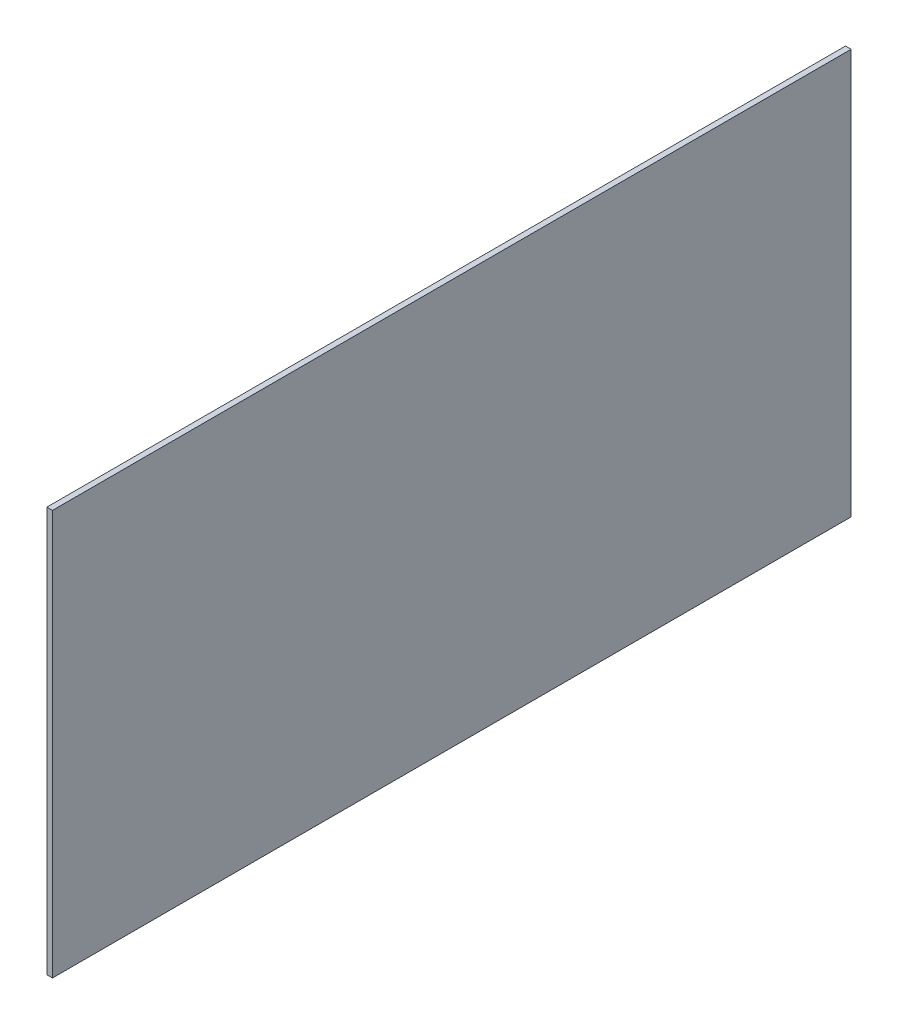
ISO-10303-21;
HEADER;
FILE_DESCRIPTION(('STEP AP214'),'2;1');
FILE_NAME('part.step','',(''),(''),'','','');
FILE_SCHEMA(('AUTOMOTIVE_DESIGN { 1 0 10303 214 1 1 1 1 }'));
ENDSEC;
DATA;
#1=APPLICATION_CONTEXT('core data for automotive mechanical design processes');
#2=APPLICATION_PROTOCOL_DEFINITION('international standard','automotive_design',2000,#1);
#3=PRODUCT_CONTEXT('',#1,'mechanical');
#4=PRODUCT('Part','Part','',(#3));
#5=PRODUCT_RELATED_PRODUCT_CATEGORY('part','',(#4));
#6=PRODUCT_DEFINITION_FORMATION('','',#4);
#7=PRODUCT_DEFINITION_CONTEXT('part definition',#1,'design');
#8=PRODUCT_DEFINITION('design','',#6,#7);
#9=PRODUCT_DEFINITION_SHAPE('','',#8);
#10=(LENGTH_UNIT() NAMED_UNIT(*) SI_UNIT(.MILLI.,.METRE.));
#11=(NAMED_UNIT(*) PLANE_ANGLE_UNIT() SI_UNIT($,.RADIAN.));
#12=(NAMED_UNIT(*) SI_UNIT($,.STERADIAN.) SOLID_ANGLE_UNIT());
#13=UNCERTAINTY_MEASURE_WITH_UNIT(LENGTH_MEASURE(1.E-05),#10,'distance_accuracy_value','');
#14=(GEOMETRIC_REPRESENTATION_CONTEXT(3) GLOBAL_UNCERTAINTY_ASSIGNED_CONTEXT((#13)) GLOBAL_UNIT_ASSIGNED_CONTEXT((#10,
#11,#12)) REPRESENTATION_CONTEXT('',''));
#15=CARTESIAN_POINT('',(0.,0.,0.));
#16=DIRECTION('',(0.,0.,1.));
#17=DIRECTION('',(1.,0.,0.));
#18=AXIS2_PLACEMENT_3D('',#15,#16,#17);
#19=CARTESIAN_POINT('',(-123.983999999927,-59.9999999998798,150.000000000048));
#20=DIRECTION('',(1.18292729294548E-10,-1.,0.));
#21=DIRECTION('',(1.,1.18292729294548E-10,0.));
#22=AXIS2_PLACEMENT_3D('',#19,#20,#21);
#23=PLANE('',#22);
#24=DIRECTION('',(1.,1.18292683688206E-10,4.73167801227374E-11));
#25=VECTOR('',#24,1.);
#26=CARTESIAN_POINT('',(-132.98399998947,-60.0000000009444,-71.000000012207));
#27=LINE('',#26,#25);
#28=CARTESIAN_POINT('',(-123.983999993728,-59.9999999998798,-71.0000000117812));
#29=VERTEX_POINT('',#28);
#30=CARTESIAN_POINT('',(-122.98399998947,-59.9999999997615,-71.0000000117339));
#31=VERTEX_POINT('',#30);
#32=EDGE_CURVE('E69',#29,#31,#27,.T.);
#33=ORIENTED_EDGE('',*,*,#32,.T.);
#34=DIRECTION('',(4.73168263820301E-11,0.,-1.));
#35=VECTOR('',#34,1.);
#36=CARTESIAN_POINT('',(-122.983999999927,-59.9999999997615,150.000000000095));
#37=LINE('',#36,#35);
#38=CARTESIAN_POINT('',(-122.983999996189,-59.9999999997615,70.9999999996222));
#39=VERTEX_POINT('',#38);
#40=EDGE_CURVE('E50',#39,#31,#37,.T.);
#41=ORIENTED_EDGE('',*,*,#40,.F.);
#42=DIRECTION('',(1.,1.18292683688206E-10,4.73167801227374E-11));
#43=VECTOR('',#42,1.);
#44=CARTESIAN_POINT('',(-132.983999996189,-60.0000000009445,70.9999999996222));
#45=LINE('',#44,#43);
#46=CARTESIAN_POINT('',(-123.983999998058,-59.9999999998798,71.0000000000481));
#47=VERTEX_POINT('',#46);
#48=EDGE_CURVE('E61',#47,#39,#45,.T.);
#49=ORIENTED_EDGE('',*,*,#48,.F.);
#50=DIRECTION('',(4.73168263820301E-11,0.,-1.));
#51=VECTOR('',#50,1.);
#52=CARTESIAN_POINT('',(-123.983999999927,-59.9999999998798,150.000000000048));
#53=LINE('',#52,#51);
#54=EDGE_CURVE('E11',#47,#29,#53,.T.);
#55=ORIENTED_EDGE('',*,*,#54,.T.);
#56=EDGE_LOOP('',(#33,#41,#49,#55));
#57=FACE_BOUND('',#56,.T.);
#58=ADVANCED_FACE('F47',(#57),#23,.T.);
#59=CARTESIAN_POINT('',(-123.983999999927,-1.46664001399963E-08,-5.86652369229645E-09));
#60=DIRECTION('',(-1.,-1.18292683688206E-10,-4.73167801227375E-11));
#61=DIRECTION('',(1.18292683688206E-10,-1.,0.));
#62=AXIS2_PLACEMENT_3D('',#59,#60,#61);
#63=PLANE('',#62);
#64=DIRECTION('',(-1.18292683688206E-10,1.,0.));
#65=VECTOR('',#64,1.);
#66=CARTESIAN_POINT('',(-123.983999996567,-1.46664001395989E-08,-71.0000000117812));
#67=LINE('',#66,#65);
#68=CARTESIAN_POINT('',(-123.984000001346,12.0000000001202,-71.0000000117812));
#69=VERTEX_POINT('',#68);
#70=EDGE_CURVE('E116',#29,#69,#67,.T.);
#71=ORIENTED_EDGE('',*,*,#70,.F.);
#72=ORIENTED_EDGE('',*,*,#54,.F.);
#73=DIRECTION('',(1.18292683688206E-10,-1.,0.));
#74=VECTOR('',#73,1.);
#75=CARTESIAN_POINT('',(-123.984000003286,-1.46664001403937E-08,71.0000000000481));
#76=LINE('',#75,#74);
#77=CARTESIAN_POINT('',(-123.984000000447,12.0000000001202,71.0000000000481));
#78=VERTEX_POINT('',#77);
#79=EDGE_CURVE('E111',#78,#47,#76,.T.);
#80=ORIENTED_EDGE('',*,*,#79,.F.);
#81=DIRECTION('',(-4.73167801227374E-11,0.,1.));
#82=VECTOR('',#81,1.);
#83=CARTESIAN_POINT('',(-123.984000001346,12.0000000001202,-5.86652222640012E-09));
#84=LINE('',#83,#82);
#85=EDGE_CURVE('E95',#69,#78,#84,.T.);
#86=ORIENTED_EDGE('',*,*,#85,.F.);
#87=EDGE_LOOP('',(#71,#72,#80,#86));
#88=FACE_BOUND('',#87,.T.);
#89=ADVANCED_FACE('F120',(#88),#63,.T.);
#90=CARTESIAN_POINT('',(-122.983999999927,-1.45481074107017E-08,-5.81920688661129E-09));
#91=DIRECTION('',(-1.,-1.18292683688206E-10,-4.73167801227375E-11));
#92=DIRECTION('',(1.18292683688206E-10,-1.,0.));
#93=AXIS2_PLACEMENT_3D('',#90,#91,#92);
#94=PLANE('',#93);
#95=ORIENTED_EDGE('',*,*,#40,.T.);
#96=DIRECTION('',(1.18292721297387E-10,-1.,0.));
#97=VECTOR('',#96,1.);
#98=CARTESIAN_POINT('',(-122.983999997987,12.0000000002385,-71.0000000117339));
#99=LINE('',#98,#97);
#100=CARTESIAN_POINT('',(-122.983999997987,12.0000000002385,-71.0000000117339));
#101=VERTEX_POINT('',#100);
#102=EDGE_CURVE('E106',#101,#31,#99,.T.);
#103=ORIENTED_EDGE('',*,*,#102,.F.);
#104=DIRECTION('',(4.7316806181302E-11,0.,-1.));
#105=VECTOR('',#104,1.);
#106=CARTESIAN_POINT('',(-122.984000004706,12.0000000002385,71.0000000000954));
#107=LINE('',#106,#105);
#108=CARTESIAN_POINT('',(-122.984000004706,12.0000000002385,71.0000000000954));
#109=VERTEX_POINT('',#108);
#110=EDGE_CURVE('E92',#109,#101,#107,.T.);
#111=ORIENTED_EDGE('',*,*,#110,.F.);
#112=DIRECTION('',(-1.18292721297387E-10,1.,0.));
#113=VECTOR('',#112,1.);
#114=CARTESIAN_POINT('',(-122.983999996189,-59.9999999997615,71.0000000000954));
#115=LINE('',#114,#113);
#116=EDGE_CURVE('E99',#39,#109,#115,.T.);
#117=ORIENTED_EDGE('',*,*,#116,.F.);
#118=EDGE_LOOP('',(#95,#103,#111,#117));
#119=FACE_BOUND('',#118,.T.);
#120=ADVANCED_FACE('F105',(#119),#94,.F.);
#121=CARTESIAN_POINT('',(-132.983999997987,11.9999999990556,-71.000000012207));
#122=DIRECTION('',(-4.73167801227374E-11,0.,1.));
#123=DIRECTION('',(1.,0.,4.73167801227374E-11));
#124=AXIS2_PLACEMENT_3D('',#121,#122,#123);
#125=PLANE('',#124);
#126=ORIENTED_EDGE('',*,*,#70,.T.);
#127=DIRECTION('',(1.,1.18292683688206E-10,4.73167801227374E-11));
#128=VECTOR('',#127,1.);
#129=CARTESIAN_POINT('',(-132.983999997987,11.9999999990556,-71.000000012207));
#130=LINE('',#129,#128);
#131=EDGE_CURVE('E97',#69,#101,#130,.T.);
#132=ORIENTED_EDGE('',*,*,#131,.T.);
#133=ORIENTED_EDGE('',*,*,#102,.T.);
#134=ORIENTED_EDGE('',*,*,#32,.F.);
#135=EDGE_LOOP('',(#126,#132,#133,#134));
#136=FACE_BOUND('',#135,.T.);
#137=ADVANCED_FACE('F126',(#136),#125,.F.);
#138=CARTESIAN_POINT('',(-132.984000004706,11.9999999990555,70.9999999996222));
#139=DIRECTION('',(1.18292683688206E-10,-1.,0.));
#140=DIRECTION('',(1.,1.18292683688206E-10,0.));
#141=AXIS2_PLACEMENT_3D('',#138,#139,#140);
#142=PLANE('',#141);
#143=ORIENTED_EDGE('',*,*,#85,.T.);
#144=DIRECTION('',(1.,1.18292683688206E-10,4.73167801227374E-11));
#145=VECTOR('',#144,1.);
#146=CARTESIAN_POINT('',(-132.984000004706,11.9999999990555,70.9999999996222));
#147=LINE('',#146,#145);
#148=EDGE_CURVE('E88',#78,#109,#147,.T.);
#149=ORIENTED_EDGE('',*,*,#148,.T.);
#150=ORIENTED_EDGE('',*,*,#110,.T.);
#151=ORIENTED_EDGE('',*,*,#131,.F.);
#152=EDGE_LOOP('',(#143,#149,#150,#151));
#153=FACE_BOUND('',#152,.T.);
#154=ADVANCED_FACE('F89',(#153),#142,.F.);
#155=CARTESIAN_POINT('',(-132.983999996189,-60.0000000009445,70.9999999996222));
#156=DIRECTION('',(4.73167801227374E-11,0.,-1.));
#157=DIRECTION('',(-1.,0.,-4.73167801227374E-11));
#158=AXIS2_PLACEMENT_3D('',#155,#156,#157);
#159=PLANE('',#158);
#160=ORIENTED_EDGE('',*,*,#79,.T.);
#161=ORIENTED_EDGE('',*,*,#48,.T.);
#162=ORIENTED_EDGE('',*,*,#116,.T.);
#163=ORIENTED_EDGE('',*,*,#148,.F.);
#164=EDGE_LOOP('',(#160,#161,#162,#163));
#165=FACE_BOUND('',#164,.T.);
#166=ADVANCED_FACE('F100',(#165),#159,.F.);
#167=CLOSED_SHELL('',(#58,#89,#120,#137,#154,#166));
#168=MANIFOLD_SOLID_BREP('B2',#167);
#169=ADVANCED_BREP_SHAPE_REPRESENTATION('',(#18,#168),#14);
#170=SHAPE_DEFINITION_REPRESENTATION(#9,#169);
ENDSEC;
END-ISO-10303-21;
